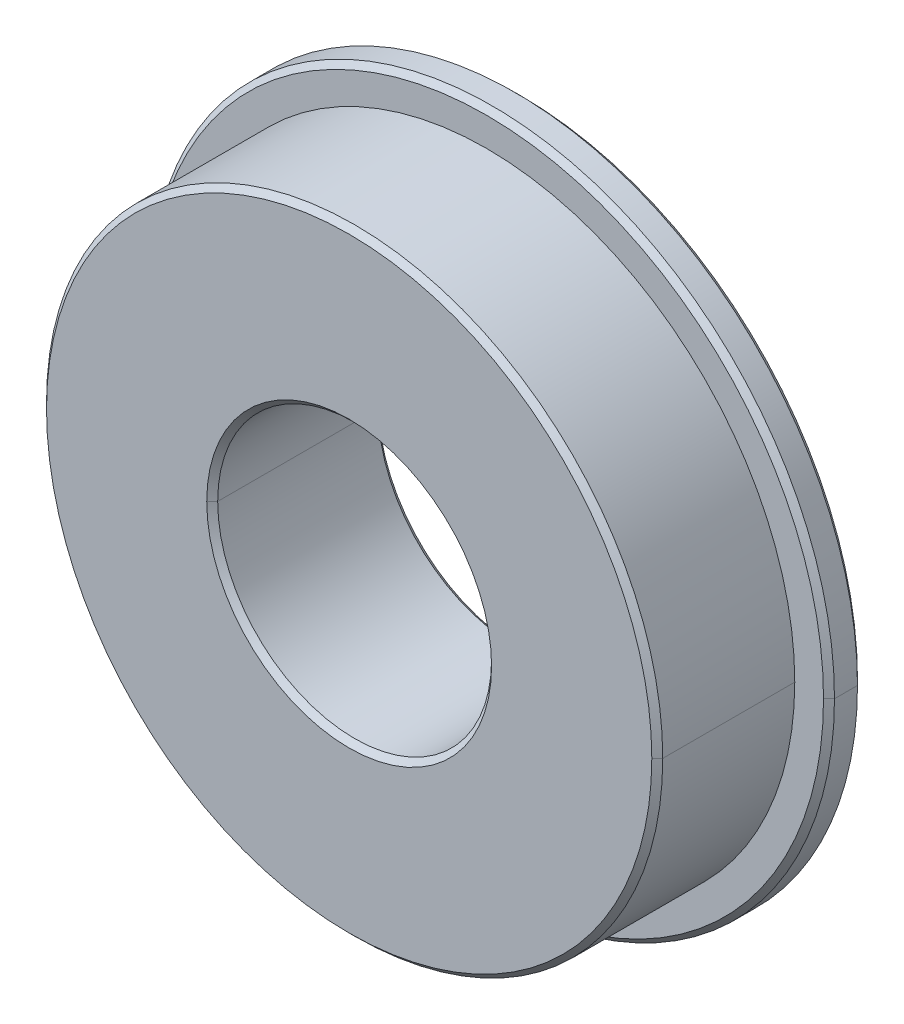
ISO-10303-21;
HEADER;
FILE_DESCRIPTION(('STEP AP214'),'2;1');
FILE_NAME('part.step','',(''),(''),'','','');
FILE_SCHEMA(('AUTOMOTIVE_DESIGN { 1 0 10303 214 1 1 1 1 }'));
ENDSEC;
DATA;
#1=APPLICATION_CONTEXT('core data for automotive mechanical design processes');
#2=APPLICATION_PROTOCOL_DEFINITION('international standard','automotive_design',2000,#1);
#3=PRODUCT_CONTEXT('',#1,'mechanical');
#4=PRODUCT('Part','Part','',(#3));
#5=PRODUCT_RELATED_PRODUCT_CATEGORY('part','',(#4));
#6=PRODUCT_DEFINITION_FORMATION('','',#4);
#7=PRODUCT_DEFINITION_CONTEXT('part definition',#1,'design');
#8=PRODUCT_DEFINITION('design','',#6,#7);
#9=PRODUCT_DEFINITION_SHAPE('','',#8);
#10=(LENGTH_UNIT() NAMED_UNIT(*) SI_UNIT(.MILLI.,.METRE.));
#11=(NAMED_UNIT(*) PLANE_ANGLE_UNIT() SI_UNIT($,.RADIAN.));
#12=(NAMED_UNIT(*) SI_UNIT($,.STERADIAN.) SOLID_ANGLE_UNIT());
#13=UNCERTAINTY_MEASURE_WITH_UNIT(LENGTH_MEASURE(1.E-05),#10,'distance_accuracy_value','');
#14=(GEOMETRIC_REPRESENTATION_CONTEXT(3) GLOBAL_UNCERTAINTY_ASSIGNED_CONTEXT((#13)) GLOBAL_UNIT_ASSIGNED_CONTEXT((#10,
#11,#12)) REPRESENTATION_CONTEXT('',''));
#15=CARTESIAN_POINT('',(0.,0.,0.));
#16=DIRECTION('',(0.,0.,1.));
#17=DIRECTION('',(1.,0.,0.));
#18=AXIS2_PLACEMENT_3D('',#15,#16,#17);
#19=CARTESIAN_POINT('',(-8.86153846153846,6.04195804195805,7.6962));
#20=DIRECTION('',(0.,0.,-1.));
#21=DIRECTION('',(-1.,0.,0.));
#22=AXIS2_PLACEMENT_3D('',#19,#20,#21);
#23=CONICAL_SURFACE('',#22,14.2875,0.78539816339745);
#24=DIRECTION('',(0.707106781186549,0.,-0.707106781186546));
#25=VECTOR('',#24,1.);
#26=CARTESIAN_POINT('',(5.42596153846154,6.04195804195805,7.6962));
#27=LINE('',#26,#25);
#28=CARTESIAN_POINT('',(5.17196153846154,6.04195804195805,7.9502));
#29=VERTEX_POINT('',#28);
#30=CARTESIAN_POINT('',(5.42596153846154,6.04195804195805,7.6962));
#31=VERTEX_POINT('',#30);
#32=EDGE_CURVE('E133',#29,#31,#27,.T.);
#33=ORIENTED_EDGE('',*,*,#32,.F.);
#34=CARTESIAN_POINT('',(-8.86153846153846,6.04195804195805,7.9502));
#35=DIRECTION('',(0.,0.,1.));
#36=DIRECTION('',(-1.,0.,0.));
#37=AXIS2_PLACEMENT_3D('',#34,#35,#36);
#38=CIRCLE('',#37,14.0335);
#39=CARTESIAN_POINT('',(-22.8950384615385,6.04195804195805,7.9502));
#40=VERTEX_POINT('',#39);
#41=EDGE_CURVE('E230',#40,#29,#38,.T.);
#42=ORIENTED_EDGE('',*,*,#41,.F.);
#43=DIRECTION('',(-0.707106781186549,0.,-0.707106781186546));
#44=VECTOR('',#43,1.);
#45=CARTESIAN_POINT('',(-23.1490384615384,6.04195804195805,7.6962));
#46=LINE('',#45,#44);
#47=CARTESIAN_POINT('',(-23.1490384615384,6.04195804195805,7.6962));
#48=VERTEX_POINT('',#47);
#49=EDGE_CURVE('E136',#40,#48,#46,.T.);
#50=ORIENTED_EDGE('',*,*,#49,.T.);
#51=CARTESIAN_POINT('',(-8.86153846153846,6.04195804195805,7.6962));
#52=DIRECTION('',(0.,0.,-1.));
#53=DIRECTION('',(-1.,0.,0.));
#54=AXIS2_PLACEMENT_3D('',#51,#52,#53);
#55=CIRCLE('',#54,14.2875);
#56=EDGE_CURVE('E130',#31,#48,#55,.T.);
#57=ORIENTED_EDGE('',*,*,#56,.F.);
#58=EDGE_LOOP('',(#33,#42,#50,#57));
#59=FACE_BOUND('',#58,.T.);
#60=ADVANCED_FACE('F16',(#59),#23,.T.);
#61=CARTESIAN_POINT('',(-8.86153846153846,6.04195804195805,1.3208));
#62=DIRECTION('',(0.,0.,-1.));
#63=DIRECTION('',(-1.,0.,0.));
#64=AXIS2_PLACEMENT_3D('',#61,#62,#63);
#65=CONICAL_SURFACE('',#64,15.875,0.78539816339745);
#66=DIRECTION('',(0.707106781186549,0.,-0.707106781186546));
#67=VECTOR('',#66,1.);
#68=CARTESIAN_POINT('',(7.01346153846154,6.04195804195805,1.3208));
#69=LINE('',#68,#67);
#70=CARTESIAN_POINT('',(6.75946153846154,6.04195804195805,1.5748));
#71=VERTEX_POINT('',#70);
#72=CARTESIAN_POINT('',(7.01346153846154,6.04195804195805,1.3208));
#73=VERTEX_POINT('',#72);
#74=EDGE_CURVE('E172',#71,#73,#69,.T.);
#75=ORIENTED_EDGE('',*,*,#74,.F.);
#76=CARTESIAN_POINT('',(-8.86153846153846,6.04195804195805,1.5748));
#77=DIRECTION('',(0.,0.,1.));
#78=DIRECTION('',(-1.,0.,0.));
#79=AXIS2_PLACEMENT_3D('',#76,#77,#78);
#80=CIRCLE('',#79,15.621);
#81=CARTESIAN_POINT('',(-24.4825384615385,6.04195804195805,1.5748));
#82=VERTEX_POINT('',#81);
#83=EDGE_CURVE('E198',#82,#71,#80,.T.);
#84=ORIENTED_EDGE('',*,*,#83,.F.);
#85=DIRECTION('',(-0.707106781186549,0.,-0.707106781186546));
#86=VECTOR('',#85,1.);
#87=CARTESIAN_POINT('',(-24.7365384615385,6.04195804195805,1.3208));
#88=LINE('',#87,#86);
#89=CARTESIAN_POINT('',(-24.7365384615385,6.04195804195805,1.3208));
#90=VERTEX_POINT('',#89);
#91=EDGE_CURVE('E171',#82,#90,#88,.T.);
#92=ORIENTED_EDGE('',*,*,#91,.T.);
#93=CARTESIAN_POINT('',(-8.86153846153846,6.04195804195805,1.3208));
#94=DIRECTION('',(0.,0.,-1.));
#95=DIRECTION('',(-1.,0.,0.));
#96=AXIS2_PLACEMENT_3D('',#93,#94,#95);
#97=CIRCLE('',#96,15.875);
#98=EDGE_CURVE('E173',#73,#90,#97,.T.);
#99=ORIENTED_EDGE('',*,*,#98,.F.);
#100=EDGE_LOOP('',(#75,#84,#92,#99));
#101=FACE_BOUND('',#100,.T.);
#102=ADVANCED_FACE('F328',(#101),#65,.T.);
#103=CARTESIAN_POINT('',(-8.86153846153846,6.04195804195805,0.));
#104=DIRECTION('',(0.,0.,1.));
#105=DIRECTION('',(1.,0.,0.));
#106=AXIS2_PLACEMENT_3D('',#103,#104,#105);
#107=CONICAL_SURFACE('',#106,15.621,0.78539816339745);
#108=DIRECTION('',(-0.707106781186549,0.,0.707106781186546));
#109=VECTOR('',#108,1.);
#110=CARTESIAN_POINT('',(-24.4825384615385,6.04195804195805,0.));
#111=LINE('',#110,#109);
#112=CARTESIAN_POINT('',(-24.4825384615385,6.04195804195805,0.));
#113=VERTEX_POINT('',#112);
#114=CARTESIAN_POINT('',(-24.7365384615385,6.04195804195805,0.254000000000004));
#115=VERTEX_POINT('',#114);
#116=EDGE_CURVE('E183',#113,#115,#111,.T.);
#117=ORIENTED_EDGE('',*,*,#116,.F.);
#118=CARTESIAN_POINT('',(-8.86153846153846,6.04195804195805,0.));
#119=DIRECTION('',(0.,0.,-1.));
#120=DIRECTION('',(-1.,0.,0.));
#121=AXIS2_PLACEMENT_3D('',#118,#119,#120);
#122=CIRCLE('',#121,15.621);
#123=CARTESIAN_POINT('',(6.75946153846154,6.04195804195805,0.));
#124=VERTEX_POINT('',#123);
#125=EDGE_CURVE('E27',#124,#113,#122,.T.);
#126=ORIENTED_EDGE('',*,*,#125,.F.);
#127=DIRECTION('',(0.707106781186549,0.,0.707106781186546));
#128=VECTOR('',#127,1.);
#129=CARTESIAN_POINT('',(6.75946153846154,6.04195804195805,0.));
#130=LINE('',#129,#128);
#131=CARTESIAN_POINT('',(7.01346153846154,6.04195804195805,0.254000000000004));
#132=VERTEX_POINT('',#131);
#133=EDGE_CURVE('E261',#124,#132,#130,.T.);
#134=ORIENTED_EDGE('',*,*,#133,.T.);
#135=CARTESIAN_POINT('',(-8.86153846153846,6.04195804195805,0.254000000000004));
#136=DIRECTION('',(0.,0.,1.));
#137=DIRECTION('',(-1.,0.,0.));
#138=AXIS2_PLACEMENT_3D('',#135,#136,#137);
#139=CIRCLE('',#138,15.875);
#140=EDGE_CURVE('E201',#115,#132,#139,.T.);
#141=ORIENTED_EDGE('',*,*,#140,.F.);
#142=EDGE_LOOP('',(#117,#126,#134,#141));
#143=FACE_BOUND('',#142,.T.);
#144=ADVANCED_FACE('F333',(#143),#107,.T.);
#145=CARTESIAN_POINT('',(-8.86153846153846,6.04195804195805,0.254000000000004));
#146=DIRECTION('',(0.,0.,-1.));
#147=DIRECTION('',(-1.,0.,0.));
#148=AXIS2_PLACEMENT_3D('',#145,#146,#147);
#149=CONICAL_SURFACE('',#148,6.35,0.785398163397447);
#150=DIRECTION('',(0.707106781186547,0.,-0.707106781186549));
#151=VECTOR('',#150,1.);
#152=CARTESIAN_POINT('',(-2.51153846153846,6.04195804195805,0.254000000000004));
#153=LINE('',#152,#151);
#154=CARTESIAN_POINT('',(-2.51153846153846,6.04195804195805,0.254000000000004));
#155=VERTEX_POINT('',#154);
#156=CARTESIAN_POINT('',(-2.25753846153846,6.04195804195805,0.));
#157=VERTEX_POINT('',#156);
#158=EDGE_CURVE('E225',#155,#157,#153,.T.);
#159=ORIENTED_EDGE('',*,*,#158,.F.);
#160=CARTESIAN_POINT('',(-8.86153846153846,6.04195804195805,0.254000000000004));
#161=DIRECTION('',(0.,0.,-1.));
#162=DIRECTION('',(-1.,0.,0.));
#163=AXIS2_PLACEMENT_3D('',#160,#161,#162);
#164=CIRCLE('',#163,6.35);
#165=CARTESIAN_POINT('',(-15.2115384615384,6.04195804195805,0.254000000000004));
#166=VERTEX_POINT('',#165);
#167=EDGE_CURVE('E203',#166,#155,#164,.T.);
#168=ORIENTED_EDGE('',*,*,#167,.F.);
#169=DIRECTION('',(-0.707106781186547,0.,-0.707106781186549));
#170=VECTOR('',#169,1.);
#171=CARTESIAN_POINT('',(-15.2115384615384,6.04195804195805,0.254000000000004));
#172=LINE('',#171,#170);
#173=CARTESIAN_POINT('',(-15.4655384615385,6.04195804195805,0.));
#174=VERTEX_POINT('',#173);
#175=EDGE_CURVE('E239',#166,#174,#172,.T.);
#176=ORIENTED_EDGE('',*,*,#175,.T.);
#177=CARTESIAN_POINT('',(-8.86153846153846,6.04195804195805,0.));
#178=DIRECTION('',(0.,0.,1.));
#179=DIRECTION('',(-1.,0.,0.));
#180=AXIS2_PLACEMENT_3D('',#177,#178,#179);
#181=CIRCLE('',#180,6.604);
#182=EDGE_CURVE('E11',#157,#174,#181,.T.);
#183=ORIENTED_EDGE('',*,*,#182,.F.);
#184=EDGE_LOOP('',(#159,#168,#176,#183));
#185=FACE_BOUND('',#184,.T.);
#186=ADVANCED_FACE('F342',(#185),#149,.F.);
#187=CARTESIAN_POINT('',(-8.86153846153846,6.04195804195805,7.9502));
#188=DIRECTION('',(0.,0.,1.));
#189=DIRECTION('',(1.,0.,0.));
#190=AXIS2_PLACEMENT_3D('',#187,#188,#189);
#191=CONICAL_SURFACE('',#190,6.604,0.785398163397447);
#192=DIRECTION('',(-0.707106781186547,0.,0.707106781186549));
#193=VECTOR('',#192,1.);
#194=CARTESIAN_POINT('',(-15.4655384615385,6.04195804195805,7.9502));
#195=LINE('',#194,#193);
#196=CARTESIAN_POINT('',(-15.2115384615384,6.04195804195805,7.6962));
#197=VERTEX_POINT('',#196);
#198=CARTESIAN_POINT('',(-15.4655384615385,6.04195804195805,7.9502));
#199=VERTEX_POINT('',#198);
#200=EDGE_CURVE('E187',#197,#199,#195,.T.);
#201=ORIENTED_EDGE('',*,*,#200,.F.);
#202=CARTESIAN_POINT('',(-8.86153846153846,6.04195804195805,7.6962));
#203=DIRECTION('',(0.,0.,1.));
#204=DIRECTION('',(-1.,0.,0.));
#205=AXIS2_PLACEMENT_3D('',#202,#203,#204);
#206=CIRCLE('',#205,6.35);
#207=CARTESIAN_POINT('',(-2.51153846153846,6.04195804195805,7.6962));
#208=VERTEX_POINT('',#207);
#209=EDGE_CURVE('E100',#208,#197,#206,.T.);
#210=ORIENTED_EDGE('',*,*,#209,.F.);
#211=DIRECTION('',(0.707106781186547,0.,0.707106781186549));
#212=VECTOR('',#211,1.);
#213=CARTESIAN_POINT('',(-2.25753846153847,6.04195804195805,7.9502));
#214=LINE('',#213,#212);
#215=CARTESIAN_POINT('',(-2.25753846153847,6.04195804195805,7.9502));
#216=VERTEX_POINT('',#215);
#217=EDGE_CURVE('E237',#208,#216,#214,.T.);
#218=ORIENTED_EDGE('',*,*,#217,.T.);
#219=CARTESIAN_POINT('',(-8.86153846153846,6.04195804195805,7.9502));
#220=DIRECTION('',(0.,0.,-1.));
#221=DIRECTION('',(-1.,0.,0.));
#222=AXIS2_PLACEMENT_3D('',#219,#220,#221);
#223=CIRCLE('',#222,6.604);
#224=EDGE_CURVE('E234',#199,#216,#223,.T.);
#225=ORIENTED_EDGE('',*,*,#224,.F.);
#226=EDGE_LOOP('',(#201,#210,#218,#225));
#227=FACE_BOUND('',#226,.T.);
#228=ADVANCED_FACE('F323',(#227),#191,.F.);
#229=CARTESIAN_POINT('',(-8.86153846153846,6.04195804195805,0.));
#230=DIRECTION('',(0.,0.,-1.));
#231=DIRECTION('',(0.,-1.,0.));
#232=AXIS2_PLACEMENT_3D('',#229,#230,#231);
#233=PLANE('',#232);
#234=CARTESIAN_POINT('',(-8.86153846153846,6.04195804195805,0.));
#235=DIRECTION('',(0.,0.,1.));
#236=DIRECTION('',(-1.,0.,0.));
#237=AXIS2_PLACEMENT_3D('',#234,#235,#236);
#238=CIRCLE('',#237,6.604);
#239=EDGE_CURVE('E20',#174,#157,#238,.T.);
#240=ORIENTED_EDGE('',*,*,#239,.T.);
#241=ORIENTED_EDGE('',*,*,#182,.T.);
#242=EDGE_LOOP('',(#240,#241));
#243=FACE_BOUND('',#242,.T.);
#244=ORIENTED_EDGE('',*,*,#125,.T.);
#245=CARTESIAN_POINT('',(-8.86153846153846,6.04195804195805,0.));
#246=DIRECTION('',(0.,0.,-1.));
#247=DIRECTION('',(-1.,0.,0.));
#248=AXIS2_PLACEMENT_3D('',#245,#246,#247);
#249=CIRCLE('',#248,15.621);
#250=EDGE_CURVE('E179',#113,#124,#249,.T.);
#251=ORIENTED_EDGE('',*,*,#250,.T.);
#252=EDGE_LOOP('',(#244,#251));
#253=FACE_BOUND('',#252,.T.);
#254=ADVANCED_FACE('F316',(#243,#253),#233,.T.);
#255=CARTESIAN_POINT('',(-8.86153846153846,6.04195804195805,7.9502));
#256=DIRECTION('',(0.,0.,-1.));
#257=DIRECTION('',(0.,-1.,0.));
#258=AXIS2_PLACEMENT_3D('',#255,#256,#257);
#259=PLANE('',#258);
#260=CARTESIAN_POINT('',(-8.86153846153846,6.04195804195805,7.9502));
#261=DIRECTION('',(0.,0.,-1.));
#262=DIRECTION('',(-1.,0.,0.));
#263=AXIS2_PLACEMENT_3D('',#260,#261,#262);
#264=CIRCLE('',#263,6.604);
#265=EDGE_CURVE('E191',#216,#199,#264,.T.);
#266=ORIENTED_EDGE('',*,*,#265,.T.);
#267=ORIENTED_EDGE('',*,*,#224,.T.);
#268=EDGE_LOOP('',(#266,#267));
#269=FACE_BOUND('',#268,.T.);
#270=ORIENTED_EDGE('',*,*,#41,.T.);
#271=CARTESIAN_POINT('',(-8.86153846153846,6.04195804195805,7.9502));
#272=DIRECTION('',(0.,0.,1.));
#273=DIRECTION('',(-1.,0.,0.));
#274=AXIS2_PLACEMENT_3D('',#271,#272,#273);
#275=CIRCLE('',#274,14.0335);
#276=EDGE_CURVE('E155',#29,#40,#275,.T.);
#277=ORIENTED_EDGE('',*,*,#276,.T.);
#278=EDGE_LOOP('',(#270,#277));
#279=FACE_BOUND('',#278,.T.);
#280=ADVANCED_FACE('F314',(#269,#279),#259,.F.);
#281=CARTESIAN_POINT('',(-8.86153846153846,6.04195804195805,7.9502));
#282=DIRECTION('',(0.,0.,1.));
#283=DIRECTION('',(-1.,0.,0.));
#284=AXIS2_PLACEMENT_3D('',#281,#282,#283);
#285=CYLINDRICAL_SURFACE('',#284,14.2875);
#286=DIRECTION('',(0.,0.,1.));
#287=VECTOR('',#286,1.);
#288=CARTESIAN_POINT('',(5.42596153846154,6.04195804195805,7.9502));
#289=LINE('',#288,#287);
#290=CARTESIAN_POINT('',(5.42596153846154,6.04195804195805,1.5748));
#291=VERTEX_POINT('',#290);
#292=EDGE_CURVE('E141',#291,#31,#289,.T.);
#293=ORIENTED_EDGE('',*,*,#292,.F.);
#294=CARTESIAN_POINT('',(-8.86153846153846,6.04195804195805,1.5748));
#295=DIRECTION('',(0.,0.,-1.));
#296=DIRECTION('',(0.,1.,0.));
#297=AXIS2_PLACEMENT_3D('',#294,#295,#296);
#298=CIRCLE('',#297,14.2875);
#299=CARTESIAN_POINT('',(-23.1490384615384,6.04195804195805,1.5748));
#300=VERTEX_POINT('',#299);
#301=EDGE_CURVE('E41',#300,#291,#298,.T.);
#302=ORIENTED_EDGE('',*,*,#301,.F.);
#303=DIRECTION('',(0.,0.,1.));
#304=VECTOR('',#303,1.);
#305=CARTESIAN_POINT('',(-23.1490384615384,6.04195804195805,7.9502));
#306=LINE('',#305,#304);
#307=EDGE_CURVE('E140',#300,#48,#306,.T.);
#308=ORIENTED_EDGE('',*,*,#307,.T.);
#309=CARTESIAN_POINT('',(-8.86153846153846,6.04195804195805,7.6962));
#310=DIRECTION('',(0.,0.,-1.));
#311=DIRECTION('',(-1.,0.,0.));
#312=AXIS2_PLACEMENT_3D('',#309,#310,#311);
#313=CIRCLE('',#312,14.2875);
#314=EDGE_CURVE('E149',#48,#31,#313,.T.);
#315=ORIENTED_EDGE('',*,*,#314,.T.);
#316=EDGE_LOOP('',(#293,#302,#308,#315));
#317=FACE_BOUND('',#316,.T.);
#318=ADVANCED_FACE('F18',(#317),#285,.T.);
#319=CARTESIAN_POINT('',(-8.86153846153846,6.04195804195805,1.5748));
#320=DIRECTION('',(0.,0.,-1.));
#321=DIRECTION('',(0.,-1.,0.));
#322=AXIS2_PLACEMENT_3D('',#319,#320,#321);
#323=PLANE('',#322);
#324=ORIENTED_EDGE('',*,*,#301,.T.);
#325=CARTESIAN_POINT('',(-8.86153846153846,6.04195804195805,1.5748));
#326=DIRECTION('',(0.,0.,-1.));
#327=DIRECTION('',(0.,1.,0.));
#328=AXIS2_PLACEMENT_3D('',#325,#326,#327);
#329=CIRCLE('',#328,14.2875);
#330=EDGE_CURVE('E146',#291,#300,#329,.T.);
#331=ORIENTED_EDGE('',*,*,#330,.T.);
#332=EDGE_LOOP('',(#324,#331));
#333=FACE_BOUND('',#332,.T.);
#334=ORIENTED_EDGE('',*,*,#83,.T.);
#335=CARTESIAN_POINT('',(-8.86153846153846,6.04195804195805,1.5748));
#336=DIRECTION('',(0.,0.,1.));
#337=DIRECTION('',(-1.,0.,0.));
#338=AXIS2_PLACEMENT_3D('',#335,#336,#337);
#339=CIRCLE('',#338,15.621);
#340=EDGE_CURVE('E185',#71,#82,#339,.T.);
#341=ORIENTED_EDGE('',*,*,#340,.T.);
#342=EDGE_LOOP('',(#334,#341));
#343=FACE_BOUND('',#342,.T.);
#344=ADVANCED_FACE('F276',(#333,#343),#323,.F.);
#345=CARTESIAN_POINT('',(-8.86153846153846,6.04195804195805,1.5748));
#346=DIRECTION('',(0.,0.,1.));
#347=DIRECTION('',(-1.,0.,0.));
#348=AXIS2_PLACEMENT_3D('',#345,#346,#347);
#349=CYLINDRICAL_SURFACE('',#348,15.875);
#350=DIRECTION('',(0.,0.,1.));
#351=VECTOR('',#350,1.);
#352=CARTESIAN_POINT('',(7.01346153846154,6.04195804195805,1.5748));
#353=LINE('',#352,#351);
#354=EDGE_CURVE('E178',#132,#73,#353,.T.);
#355=ORIENTED_EDGE('',*,*,#354,.F.);
#356=CARTESIAN_POINT('',(-8.86153846153846,6.04195804195805,0.254000000000004));
#357=DIRECTION('',(0.,0.,1.));
#358=DIRECTION('',(-1.,0.,0.));
#359=AXIS2_PLACEMENT_3D('',#356,#357,#358);
#360=CIRCLE('',#359,15.875);
#361=EDGE_CURVE('E166',#132,#115,#360,.T.);
#362=ORIENTED_EDGE('',*,*,#361,.T.);
#363=DIRECTION('',(0.,0.,1.));
#364=VECTOR('',#363,1.);
#365=CARTESIAN_POINT('',(-24.7365384615385,6.04195804195805,1.5748));
#366=LINE('',#365,#364);
#367=EDGE_CURVE('E177',#115,#90,#366,.T.);
#368=ORIENTED_EDGE('',*,*,#367,.T.);
#369=CARTESIAN_POINT('',(-8.86153846153846,6.04195804195805,1.3208));
#370=DIRECTION('',(0.,0.,-1.));
#371=DIRECTION('',(-1.,0.,0.));
#372=AXIS2_PLACEMENT_3D('',#369,#370,#371);
#373=CIRCLE('',#372,15.875);
#374=EDGE_CURVE('E168',#90,#73,#373,.T.);
#375=ORIENTED_EDGE('',*,*,#374,.T.);
#376=EDGE_LOOP('',(#355,#362,#368,#375));
#377=FACE_BOUND('',#376,.T.);
#378=ADVANCED_FACE('F337',(#377),#349,.T.);
#379=CARTESIAN_POINT('',(-8.86153846153846,6.04195804195805,1.5748));
#380=DIRECTION('',(0.,0.,1.));
#381=DIRECTION('',(-1.,0.,0.));
#382=AXIS2_PLACEMENT_3D('',#379,#380,#381);
#383=CYLINDRICAL_SURFACE('',#382,6.35);
#384=DIRECTION('',(0.,0.,1.));
#385=VECTOR('',#384,1.);
#386=CARTESIAN_POINT('',(-2.51153846153846,6.04195804195805,1.5748));
#387=LINE('',#386,#385);
#388=EDGE_CURVE('E211',#155,#208,#387,.T.);
#389=ORIENTED_EDGE('',*,*,#388,.F.);
#390=CARTESIAN_POINT('',(-8.86153846153846,6.04195804195805,0.254000000000004));
#391=DIRECTION('',(0.,0.,-1.));
#392=DIRECTION('',(-1.,0.,0.));
#393=AXIS2_PLACEMENT_3D('',#390,#391,#392);
#394=CIRCLE('',#393,6.35);
#395=EDGE_CURVE('E229',#155,#166,#394,.T.);
#396=ORIENTED_EDGE('',*,*,#395,.T.);
#397=DIRECTION('',(0.,0.,1.));
#398=VECTOR('',#397,1.);
#399=CARTESIAN_POINT('',(-15.2115384615384,6.04195804195805,1.5748));
#400=LINE('',#399,#398);
#401=EDGE_CURVE('E115',#166,#197,#400,.T.);
#402=ORIENTED_EDGE('',*,*,#401,.T.);
#403=CARTESIAN_POINT('',(-8.86153846153846,6.04195804195805,7.6962));
#404=DIRECTION('',(0.,0.,1.));
#405=DIRECTION('',(-1.,0.,0.));
#406=AXIS2_PLACEMENT_3D('',#403,#404,#405);
#407=CIRCLE('',#406,6.35);
#408=EDGE_CURVE('E192',#197,#208,#407,.T.);
#409=ORIENTED_EDGE('',*,*,#408,.T.);
#410=EDGE_LOOP('',(#389,#396,#402,#409));
#411=FACE_BOUND('',#410,.T.);
#412=ADVANCED_FACE('F298',(#411),#383,.F.);
#413=CARTESIAN_POINT('',(-8.86153846153846,6.04195804195805,1.5748));
#414=DIRECTION('',(0.,0.,1.));
#415=DIRECTION('',(-1.,0.,0.));
#416=AXIS2_PLACEMENT_3D('',#413,#414,#415);
#417=CYLINDRICAL_SURFACE('',#416,6.35);
#418=ORIENTED_EDGE('',*,*,#167,.T.);
#419=ORIENTED_EDGE('',*,*,#388,.T.);
#420=ORIENTED_EDGE('',*,*,#209,.T.);
#421=ORIENTED_EDGE('',*,*,#401,.F.);
#422=EDGE_LOOP('',(#418,#419,#420,#421));
#423=FACE_BOUND('',#422,.T.);
#424=ADVANCED_FACE('F357',(#423),#417,.F.);
#425=CARTESIAN_POINT('',(-8.86153846153846,6.04195804195805,1.5748));
#426=DIRECTION('',(0.,0.,1.));
#427=DIRECTION('',(-1.,0.,0.));
#428=AXIS2_PLACEMENT_3D('',#425,#426,#427);
#429=CYLINDRICAL_SURFACE('',#428,15.875);
#430=ORIENTED_EDGE('',*,*,#140,.T.);
#431=ORIENTED_EDGE('',*,*,#354,.T.);
#432=ORIENTED_EDGE('',*,*,#98,.T.);
#433=ORIENTED_EDGE('',*,*,#367,.F.);
#434=EDGE_LOOP('',(#430,#431,#432,#433));
#435=FACE_BOUND('',#434,.T.);
#436=ADVANCED_FACE('F350',(#435),#429,.T.);
#437=CARTESIAN_POINT('',(-8.86153846153846,6.04195804195805,7.9502));
#438=DIRECTION('',(0.,0.,1.));
#439=DIRECTION('',(-1.,0.,0.));
#440=AXIS2_PLACEMENT_3D('',#437,#438,#439);
#441=CYLINDRICAL_SURFACE('',#440,14.2875);
#442=ORIENTED_EDGE('',*,*,#330,.F.);
#443=ORIENTED_EDGE('',*,*,#292,.T.);
#444=ORIENTED_EDGE('',*,*,#56,.T.);
#445=ORIENTED_EDGE('',*,*,#307,.F.);
#446=EDGE_LOOP('',(#442,#443,#444,#445));
#447=FACE_BOUND('',#446,.T.);
#448=ADVANCED_FACE('F144',(#447),#441,.T.);
#449=CARTESIAN_POINT('',(-8.86153846153846,6.04195804195805,7.9502));
#450=DIRECTION('',(0.,0.,1.));
#451=DIRECTION('',(1.,0.,0.));
#452=AXIS2_PLACEMENT_3D('',#449,#450,#451);
#453=CONICAL_SURFACE('',#452,6.604,0.785398163397447);
#454=ORIENTED_EDGE('',*,*,#408,.F.);
#455=ORIENTED_EDGE('',*,*,#200,.T.);
#456=ORIENTED_EDGE('',*,*,#265,.F.);
#457=ORIENTED_EDGE('',*,*,#217,.F.);
#458=EDGE_LOOP('',(#454,#455,#456,#457));
#459=FACE_BOUND('',#458,.T.);
#460=ADVANCED_FACE('F349',(#459),#453,.F.);
#461=CARTESIAN_POINT('',(-8.86153846153846,6.04195804195805,0.254000000000004));
#462=DIRECTION('',(0.,0.,-1.));
#463=DIRECTION('',(-1.,0.,0.));
#464=AXIS2_PLACEMENT_3D('',#461,#462,#463);
#465=CONICAL_SURFACE('',#464,6.35,0.785398163397447);
#466=ORIENTED_EDGE('',*,*,#395,.F.);
#467=ORIENTED_EDGE('',*,*,#158,.T.);
#468=ORIENTED_EDGE('',*,*,#239,.F.);
#469=ORIENTED_EDGE('',*,*,#175,.F.);
#470=EDGE_LOOP('',(#466,#467,#468,#469));
#471=FACE_BOUND('',#470,.T.);
#472=ADVANCED_FACE('F301',(#471),#465,.F.);
#473=CARTESIAN_POINT('',(-8.86153846153846,6.04195804195805,0.));
#474=DIRECTION('',(0.,0.,1.));
#475=DIRECTION('',(1.,0.,0.));
#476=AXIS2_PLACEMENT_3D('',#473,#474,#475);
#477=CONICAL_SURFACE('',#476,15.621,0.78539816339745);
#478=ORIENTED_EDGE('',*,*,#250,.F.);
#479=ORIENTED_EDGE('',*,*,#116,.T.);
#480=ORIENTED_EDGE('',*,*,#361,.F.);
#481=ORIENTED_EDGE('',*,*,#133,.F.);
#482=EDGE_LOOP('',(#478,#479,#480,#481));
#483=FACE_BOUND('',#482,.T.);
#484=ADVANCED_FACE('F366',(#483),#477,.T.);
#485=CARTESIAN_POINT('',(-8.86153846153846,6.04195804195805,1.3208));
#486=DIRECTION('',(0.,0.,-1.));
#487=DIRECTION('',(-1.,0.,0.));
#488=AXIS2_PLACEMENT_3D('',#485,#486,#487);
#489=CONICAL_SURFACE('',#488,15.875,0.78539816339745);
#490=ORIENTED_EDGE('',*,*,#340,.F.);
#491=ORIENTED_EDGE('',*,*,#74,.T.);
#492=ORIENTED_EDGE('',*,*,#374,.F.);
#493=ORIENTED_EDGE('',*,*,#91,.F.);
#494=EDGE_LOOP('',(#490,#491,#492,#493));
#495=FACE_BOUND('',#494,.T.);
#496=ADVANCED_FACE('F280',(#495),#489,.T.);
#497=CARTESIAN_POINT('',(-8.86153846153846,6.04195804195805,7.6962));
#498=DIRECTION('',(0.,0.,-1.));
#499=DIRECTION('',(-1.,0.,0.));
#500=AXIS2_PLACEMENT_3D('',#497,#498,#499);
#501=CONICAL_SURFACE('',#500,14.2875,0.78539816339745);
#502=ORIENTED_EDGE('',*,*,#276,.F.);
#503=ORIENTED_EDGE('',*,*,#32,.T.);
#504=ORIENTED_EDGE('',*,*,#314,.F.);
#505=ORIENTED_EDGE('',*,*,#49,.F.);
#506=EDGE_LOOP('',(#502,#503,#504,#505));
#507=FACE_BOUND('',#506,.T.);
#508=ADVANCED_FACE('F153',(#507),#501,.T.);
#509=CLOSED_SHELL('',(#60,#102,#144,#186,#228,#254,#280,#318,#344,#378,#412,#424,#436,#448,#460,
#472,#484,#496,#508));
#510=MANIFOLD_SOLID_BREP('B1',#509);
#511=ADVANCED_BREP_SHAPE_REPRESENTATION('',(#18,#510),#14);
#512=SHAPE_DEFINITION_REPRESENTATION(#9,#511);
ENDSEC;
END-ISO-10303-21;
